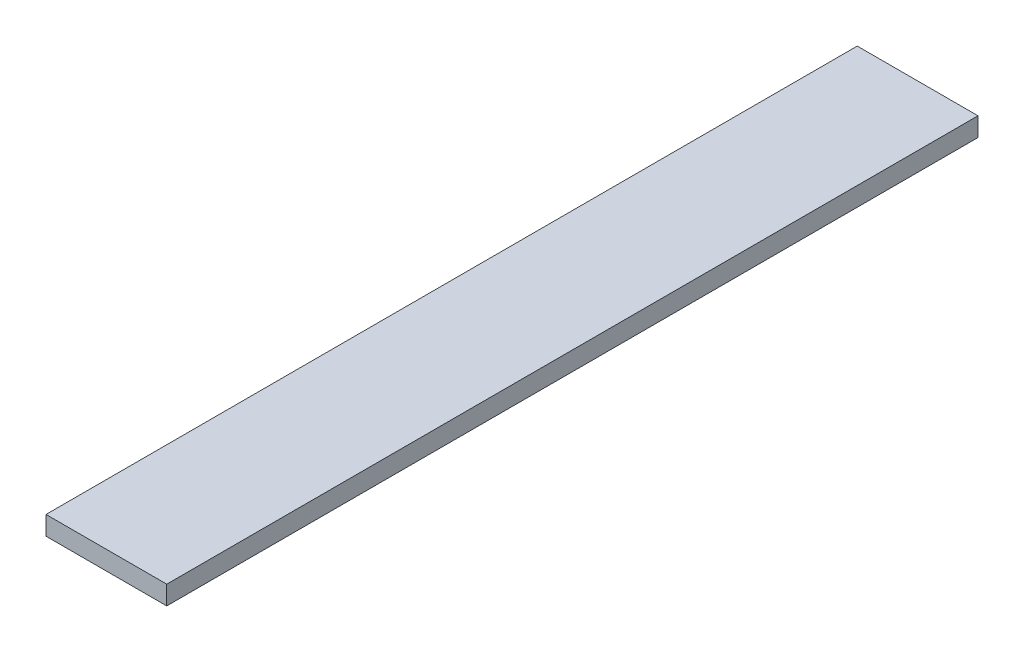
ISO-10303-21;
HEADER;
FILE_DESCRIPTION(('STEP AP214'),'2;1');
FILE_NAME('part.step','',(''),(''),'','','');
FILE_SCHEMA(('AUTOMOTIVE_DESIGN { 1 0 10303 214 1 1 1 1 }'));
ENDSEC;
DATA;
#1=APPLICATION_CONTEXT('core data for automotive mechanical design processes');
#2=APPLICATION_PROTOCOL_DEFINITION('international standard','automotive_design',2000,#1);
#3=PRODUCT_CONTEXT('',#1,'mechanical');
#4=PRODUCT('Part','Part','',(#3));
#5=PRODUCT_RELATED_PRODUCT_CATEGORY('part','',(#4));
#6=PRODUCT_DEFINITION_FORMATION('','',#4);
#7=PRODUCT_DEFINITION_CONTEXT('part definition',#1,'design');
#8=PRODUCT_DEFINITION('design','',#6,#7);
#9=PRODUCT_DEFINITION_SHAPE('','',#8);
#10=(LENGTH_UNIT() NAMED_UNIT(*) SI_UNIT(.MILLI.,.METRE.));
#11=(NAMED_UNIT(*) PLANE_ANGLE_UNIT() SI_UNIT($,.RADIAN.));
#12=(NAMED_UNIT(*) SI_UNIT($,.STERADIAN.) SOLID_ANGLE_UNIT());
#13=UNCERTAINTY_MEASURE_WITH_UNIT(LENGTH_MEASURE(1.E-05),#10,'distance_accuracy_value','');
#14=(GEOMETRIC_REPRESENTATION_CONTEXT(3) GLOBAL_UNCERTAINTY_ASSIGNED_CONTEXT((#13)) GLOBAL_UNIT_ASSIGNED_CONTEXT((#10,
#11,#12)) REPRESENTATION_CONTEXT('',''));
#15=CARTESIAN_POINT('',(0.,0.,0.));
#16=DIRECTION('',(0.,0.,1.));
#17=DIRECTION('',(1.,0.,0.));
#18=AXIS2_PLACEMENT_3D('',#15,#16,#17);
#19=CARTESIAN_POINT('',(-48.,7.49999999999999,645.));
#20=DIRECTION('',(1.,0.,0.));
#21=DIRECTION('',(0.,0.,-1.));
#22=AXIS2_PLACEMENT_3D('',#19,#20,#21);
#23=PLANE('',#22);
#24=DIRECTION('',(0.,-1.,0.));
#25=VECTOR('',#24,1.);
#26=CARTESIAN_POINT('',(-48.,7.49999999999999,0.));
#27=LINE('',#26,#25);
#28=CARTESIAN_POINT('',(-48.,7.49999999999999,0.));
#29=VERTEX_POINT('',#28);
#30=CARTESIAN_POINT('',(-48.,-7.50000000000001,0.));
#31=VERTEX_POINT('',#30);
#32=EDGE_CURVE('E108',#29,#31,#27,.T.);
#33=ORIENTED_EDGE('',*,*,#32,.T.);
#34=DIRECTION('',(0.,0.,-1.));
#35=VECTOR('',#34,1.);
#36=CARTESIAN_POINT('',(-48.,-7.50000000000001,645.));
#37=LINE('',#36,#35);
#38=CARTESIAN_POINT('',(-48.,-7.50000000000001,645.));
#39=VERTEX_POINT('',#38);
#40=EDGE_CURVE('E11',#39,#31,#37,.T.);
#41=ORIENTED_EDGE('',*,*,#40,.F.);
#42=DIRECTION('',(0.,-1.,0.));
#43=VECTOR('',#42,1.);
#44=CARTESIAN_POINT('',(-48.,7.49999999999999,645.));
#45=LINE('',#44,#43);
#46=CARTESIAN_POINT('',(-48.,7.49999999999999,645.));
#47=VERTEX_POINT('',#46);
#48=EDGE_CURVE('E96',#47,#39,#45,.T.);
#49=ORIENTED_EDGE('',*,*,#48,.F.);
#50=DIRECTION('',(0.,0.,-1.));
#51=VECTOR('',#50,1.);
#52=CARTESIAN_POINT('',(-48.,7.49999999999999,645.));
#53=LINE('',#52,#51);
#54=EDGE_CURVE('E104',#47,#29,#53,.T.);
#55=ORIENTED_EDGE('',*,*,#54,.T.);
#56=EDGE_LOOP('',(#33,#41,#49,#55));
#57=FACE_BOUND('',#56,.T.);
#58=ADVANCED_FACE('F45',(#57),#23,.F.);
#59=CARTESIAN_POINT('',(48.,-7.49999999999999,645.));
#60=DIRECTION('',(0.,1.,0.));
#61=DIRECTION('',(-1.,0.,0.));
#62=AXIS2_PLACEMENT_3D('',#59,#60,#61);
#63=PLANE('',#62);
#64=DIRECTION('',(1.,0.,0.));
#65=VECTOR('',#64,1.);
#66=CARTESIAN_POINT('',(48.,-7.49999999999999,0.));
#67=LINE('',#66,#65);
#68=CARTESIAN_POINT('',(48.,-7.49999999999999,0.));
#69=VERTEX_POINT('',#68);
#70=EDGE_CURVE('E100',#31,#69,#67,.T.);
#71=ORIENTED_EDGE('',*,*,#70,.T.);
#72=DIRECTION('',(0.,0.,-1.));
#73=VECTOR('',#72,1.);
#74=CARTESIAN_POINT('',(48.,-7.49999999999999,645.));
#75=LINE('',#74,#73);
#76=CARTESIAN_POINT('',(48.,-7.49999999999999,645.));
#77=VERTEX_POINT('',#76);
#78=EDGE_CURVE('E53',#77,#69,#75,.T.);
#79=ORIENTED_EDGE('',*,*,#78,.F.);
#80=DIRECTION('',(1.,0.,0.));
#81=VECTOR('',#80,1.);
#82=CARTESIAN_POINT('',(48.,-7.49999999999999,645.));
#83=LINE('',#82,#81);
#84=EDGE_CURVE('E91',#39,#77,#83,.T.);
#85=ORIENTED_EDGE('',*,*,#84,.F.);
#86=ORIENTED_EDGE('',*,*,#40,.T.);
#87=EDGE_LOOP('',(#71,#79,#85,#86));
#88=FACE_BOUND('',#87,.T.);
#89=ADVANCED_FACE('F99',(#88),#63,.F.);
#90=CARTESIAN_POINT('',(48.,7.50000000000001,645.));
#91=DIRECTION('',(-1.,0.,0.));
#92=DIRECTION('',(0.,0.,1.));
#93=AXIS2_PLACEMENT_3D('',#90,#91,#92);
#94=PLANE('',#93);
#95=DIRECTION('',(0.,1.,0.));
#96=VECTOR('',#95,1.);
#97=CARTESIAN_POINT('',(48.,7.50000000000001,0.));
#98=LINE('',#97,#96);
#99=CARTESIAN_POINT('',(48.,7.50000000000001,0.));
#100=VERTEX_POINT('',#99);
#101=EDGE_CURVE('E78',#69,#100,#98,.T.);
#102=ORIENTED_EDGE('',*,*,#101,.T.);
#103=DIRECTION('',(0.,0.,-1.));
#104=VECTOR('',#103,1.);
#105=CARTESIAN_POINT('',(48.,7.50000000000001,645.));
#106=LINE('',#105,#104);
#107=CARTESIAN_POINT('',(48.,7.50000000000001,645.));
#108=VERTEX_POINT('',#107);
#109=EDGE_CURVE('E101',#108,#100,#106,.T.);
#110=ORIENTED_EDGE('',*,*,#109,.F.);
#111=DIRECTION('',(0.,1.,0.));
#112=VECTOR('',#111,1.);
#113=CARTESIAN_POINT('',(48.,7.50000000000001,645.));
#114=LINE('',#113,#112);
#115=EDGE_CURVE('E94',#77,#108,#114,.T.);
#116=ORIENTED_EDGE('',*,*,#115,.F.);
#117=ORIENTED_EDGE('',*,*,#78,.T.);
#118=EDGE_LOOP('',(#102,#110,#116,#117));
#119=FACE_BOUND('',#118,.T.);
#120=ADVANCED_FACE('F102',(#119),#94,.F.);
#121=CARTESIAN_POINT('',(48.,7.50000000000001,645.));
#122=DIRECTION('',(0.,-1.,0.));
#123=DIRECTION('',(1.,0.,0.));
#124=AXIS2_PLACEMENT_3D('',#121,#122,#123);
#125=PLANE('',#124);
#126=DIRECTION('',(-1.,0.,0.));
#127=VECTOR('',#126,1.);
#128=CARTESIAN_POINT('',(48.,7.50000000000001,0.));
#129=LINE('',#128,#127);
#130=EDGE_CURVE('E84',#100,#29,#129,.T.);
#131=ORIENTED_EDGE('',*,*,#130,.T.);
#132=ORIENTED_EDGE('',*,*,#54,.F.);
#133=DIRECTION('',(-1.,0.,0.));
#134=VECTOR('',#133,1.);
#135=CARTESIAN_POINT('',(48.,7.50000000000001,645.));
#136=LINE('',#135,#134);
#137=EDGE_CURVE('E61',#108,#47,#136,.T.);
#138=ORIENTED_EDGE('',*,*,#137,.F.);
#139=ORIENTED_EDGE('',*,*,#109,.T.);
#140=EDGE_LOOP('',(#131,#132,#138,#139));
#141=FACE_BOUND('',#140,.T.);
#142=ADVANCED_FACE('F115',(#141),#125,.F.);
#143=CARTESIAN_POINT('',(0.,0.,645.));
#144=DIRECTION('',(0.,0.,-1.));
#145=DIRECTION('',(-1.,0.,0.));
#146=AXIS2_PLACEMENT_3D('',#143,#144,#145);
#147=PLANE('',#146);
#148=ORIENTED_EDGE('',*,*,#48,.T.);
#149=ORIENTED_EDGE('',*,*,#84,.T.);
#150=ORIENTED_EDGE('',*,*,#115,.T.);
#151=ORIENTED_EDGE('',*,*,#137,.T.);
#152=EDGE_LOOP('',(#148,#149,#150,#151));
#153=FACE_BOUND('',#152,.T.);
#154=ADVANCED_FACE('F92',(#153),#147,.F.);
#155=CARTESIAN_POINT('',(0.,0.,0.));
#156=DIRECTION('',(0.,0.,-1.));
#157=DIRECTION('',(-1.,0.,0.));
#158=AXIS2_PLACEMENT_3D('',#155,#156,#157);
#159=PLANE('',#158);
#160=ORIENTED_EDGE('',*,*,#32,.F.);
#161=ORIENTED_EDGE('',*,*,#130,.F.);
#162=ORIENTED_EDGE('',*,*,#101,.F.);
#163=ORIENTED_EDGE('',*,*,#70,.F.);
#164=EDGE_LOOP('',(#160,#161,#162,#163));
#165=FACE_BOUND('',#164,.T.);
#166=ADVANCED_FACE('F118',(#165),#159,.T.);
#167=CLOSED_SHELL('',(#58,#89,#120,#142,#154,#166));
#168=MANIFOLD_SOLID_BREP('B2',#167);
#169=ADVANCED_BREP_SHAPE_REPRESENTATION('',(#18,#168),#14);
#170=SHAPE_DEFINITION_REPRESENTATION(#9,#169);
ENDSEC;
END-ISO-10303-21;
